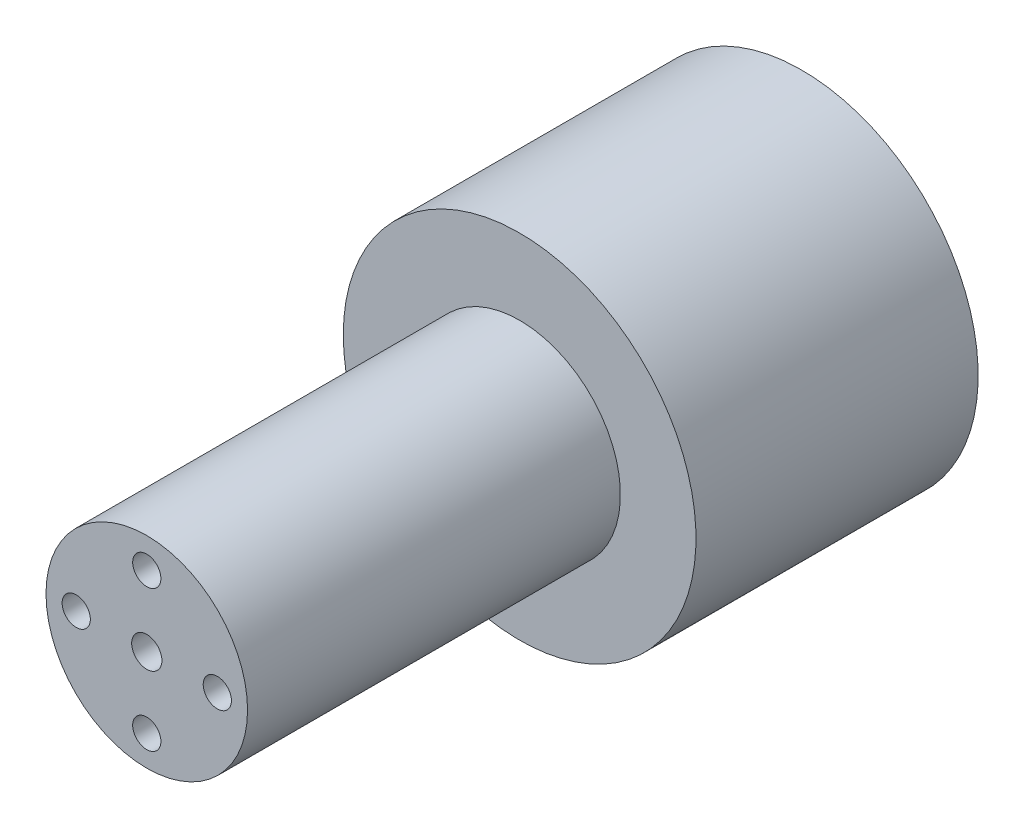
ISO-10303-21;
HEADER;
FILE_DESCRIPTION(('STEP AP214'),'2;1');
FILE_NAME('part.step','',(''),(''),'','','');
FILE_SCHEMA(('AUTOMOTIVE_DESIGN { 1 0 10303 214 1 1 1 1 }'));
ENDSEC;
DATA;
#1=APPLICATION_CONTEXT('core data for automotive mechanical design processes');
#2=APPLICATION_PROTOCOL_DEFINITION('international standard','automotive_design',2000,#1);
#3=PRODUCT_CONTEXT('',#1,'mechanical');
#4=PRODUCT('Part','Part','',(#3));
#5=PRODUCT_RELATED_PRODUCT_CATEGORY('part','',(#4));
#6=PRODUCT_DEFINITION_FORMATION('','',#4);
#7=PRODUCT_DEFINITION_CONTEXT('part definition',#1,'design');
#8=PRODUCT_DEFINITION('design','',#6,#7);
#9=PRODUCT_DEFINITION_SHAPE('','',#8);
#10=(LENGTH_UNIT() NAMED_UNIT(*) SI_UNIT(.MILLI.,.METRE.));
#11=(NAMED_UNIT(*) PLANE_ANGLE_UNIT() SI_UNIT($,.RADIAN.));
#12=(NAMED_UNIT(*) SI_UNIT($,.STERADIAN.) SOLID_ANGLE_UNIT());
#13=UNCERTAINTY_MEASURE_WITH_UNIT(LENGTH_MEASURE(1.E-05),#10,'distance_accuracy_value','');
#14=(GEOMETRIC_REPRESENTATION_CONTEXT(3) GLOBAL_UNCERTAINTY_ASSIGNED_CONTEXT((#13)) GLOBAL_UNIT_ASSIGNED_CONTEXT((#10,
#11,#12)) REPRESENTATION_CONTEXT('',''));
#15=CARTESIAN_POINT('',(0.,0.,0.));
#16=DIRECTION('',(0.,0.,1.));
#17=DIRECTION('',(1.,0.,0.));
#18=AXIS2_PLACEMENT_3D('',#15,#16,#17);
#19=CARTESIAN_POINT('',(0.,0.,65.));
#20=DIRECTION('',(0.,0.,-1.));
#21=DIRECTION('',(-1.,0.,0.));
#22=AXIS2_PLACEMENT_3D('',#19,#20,#21);
#23=CYLINDRICAL_SURFACE('',#22,10.);
#24=CARTESIAN_POINT('',(0.,0.,65.));
#25=DIRECTION('',(0.,0.,1.));
#26=DIRECTION('',(1.,0.,0.));
#27=AXIS2_PLACEMENT_3D('',#24,#25,#26);
#28=CIRCLE('',#27,10.);
#29=CARTESIAN_POINT('',(10.,0.,65.));
#30=VERTEX_POINT('',#29);
#31=EDGE_CURVE('E119',#30,#30,#28,.T.);
#32=ORIENTED_EDGE('',*,*,#31,.F.);
#33=EDGE_LOOP('',(#32));
#34=FACE_BOUND('',#33,.T.);
#35=DIRECTION('',(0.,0.,-1.));
#36=VECTOR('',#35,1.);
#37=CARTESIAN_POINT('',(-9.66941053012023,2.55,65.));
#38=LINE('',#37,#36);
#39=CARTESIAN_POINT('',(-9.66941053012023,2.55,30.6));
#40=VERTEX_POINT('',#39);
#41=CARTESIAN_POINT('',(-9.66941053012023,2.55,37.6));
#42=VERTEX_POINT('',#41);
#43=EDGE_CURVE('E48',#40,#42,#38,.F.);
#44=ORIENTED_EDGE('',*,*,#43,.T.);
#45=CARTESIAN_POINT('',(-9.66941053012023,2.55,37.6));
#46=CARTESIAN_POINT('',(-9.66940247091719,2.5500082217057,37.6704715696643));
#47=CARTESIAN_POINT('',(-9.67018075432079,2.54707880843191,37.7409382259624));
#48=CARTESIAN_POINT('',(-9.67325022280697,2.53540857884758,37.8813436254274));
#49=CARTESIAN_POINT('',(-9.67554114560532,2.52666877002919,37.9512824579902));
#50=CARTESIAN_POINT('',(-9.68157003277275,2.5034651108048,38.0899982076245));
#51=CARTESIAN_POINT('',(-9.68530505524447,2.48901289629602,38.1587771921356));
#52=CARTESIAN_POINT('',(-9.69410383624422,2.45451934485845,38.2948132437216));
#53=CARTESIAN_POINT('',(-9.69916761452135,2.43447792485779,38.36207028816));
#54=CARTESIAN_POINT('',(-9.71613940671657,2.36619215086458,38.5608410225915));
#55=CARTESIAN_POINT('',(-9.72983453938418,2.30976218738288,38.6894970261858));
#56=CARTESIAN_POINT('',(-9.76043395270896,2.17682160087181,38.9354907950415));
#57=CARTESIAN_POINT('',(-9.77733915217684,2.10030522614678,39.0528253052384));
#58=CARTESIAN_POINT('',(-9.81288474482669,1.92748947287877,39.2755732414094));
#59=CARTESIAN_POINT('',(-9.83155360195259,1.83081674855425,39.3806930253747));
#60=CARTESIAN_POINT('',(-9.86827756398352,1.6212336610022,39.5734177844683));
#61=CARTESIAN_POINT('',(-9.88633256996893,1.50832069591604,39.6610199477023));
#62=CARTESIAN_POINT('',(-9.92011108915336,1.26743000946384,39.8174391329621));
#63=CARTESIAN_POINT('',(-9.93579686208664,1.13925702147345,39.8859643247486));
#64=CARTESIAN_POINT('',(-9.96274141902185,0.872750506736556,40.0003802752384));
#65=CARTESIAN_POINT('',(-9.97400109876267,0.734419042562903,40.0462756141792));
#66=CARTESIAN_POINT('',(-9.9906234857324,0.454603386462816,40.1131835316442));
#67=CARTESIAN_POINT('',(-9.99610520280259,0.313246635675868,40.1346989962895));
#68=CARTESIAN_POINT('',(-10.0009692114179,0.0288277357160064,40.1538160254126));
#69=CARTESIAN_POINT('',(-10.0003523053173,-0.114234186645626,40.1514207356646));
#70=CARTESIAN_POINT('',(-9.99317651921549,-0.394504538944483,40.1231428343567));
#71=CARTESIAN_POINT('',(-9.98675513936942,-0.531771856474864,40.0978037077785));
#72=CARTESIAN_POINT('',(-9.96885274870285,-0.800036620932126,40.0252325687347));
#73=CARTESIAN_POINT('',(-9.95737150900061,-0.931033783932646,39.977999565899));
#74=CARTESIAN_POINT('',(-9.93043082294116,-1.18446145517981,39.8625479906677));
#75=CARTESIAN_POINT('',(-9.91493528250005,-1.30680070110949,39.7941378581642));
#76=CARTESIAN_POINT('',(-9.88164407025453,-1.53844901436685,39.6384209493071));
#77=CARTESIAN_POINT('',(-9.86384803552788,-1.64775602050821,39.5511111899102));
#78=CARTESIAN_POINT('',(-9.82730275979038,-1.85347084883836,39.3571802766826));
#79=CARTESIAN_POINT('',(-9.80854078244409,-1.94943121271789,39.2500864116534));
#80=CARTESIAN_POINT('',(-9.7726283391012,-2.1221551920232,39.0210997024044));
#81=CARTESIAN_POINT('',(-9.75547831604193,-2.19891354063648,38.899202811535));
#82=CARTESIAN_POINT('',(-9.72468067624462,-2.33136305128059,38.6431453248529));
#83=CARTESIAN_POINT('',(-9.71105376512276,-2.38693054060623,38.5089182436655));
#84=CARTESIAN_POINT('',(-9.68911390250113,-2.47449871004449,38.2326737317785));
#85=CARTESIAN_POINT('',(-9.68079299964735,-2.50653466449171,38.0906683058226));
#86=CARTESIAN_POINT('',(-9.67357106315976,-2.53418003968817,37.8895195725719));
#87=CARTESIAN_POINT('',(-9.67201335983389,-2.54011341119641,37.8317383624252));
#88=CARTESIAN_POINT('',(-9.66993350396698,-2.54801900884579,37.7159806476918));
#89=CARTESIAN_POINT('',(-9.66940968610688,-2.54999760516071,37.6580046080886));
#90=CARTESIAN_POINT('',(-9.66941053012023,-2.55,37.6));
#91=B_SPLINE_CURVE_WITH_KNOTS('',3,(#45,#46,#47,#48,#49,#50,#51,#52,#53,#54,#55,#56,#57,#58,#59,
#60,#61,#62,#63,#64,#65,#66,#67,#68,#69,#70,#71,#72,#73,#74,#75,#76,#77,#78,#79,#80,#81,#82,#83,
#84,#85,#86,#87,#88,#89,#90),.UNSPECIFIED.,.F.,.F.,(4,2,2,2,2,2,2,2,2,2,2,2,2,2,2,2,2,2,2,2,2,2,
4),(0.,0.211341087985787,0.422645540088371,0.633521775091463,0.844401144496735,1.26573069222128,
1.68718101850248,2.11726981586689,2.54742759492469,2.98384338004687,3.420170799183,
3.8473241654089,4.27442133473423,4.69165889954669,5.10891533995249,5.53006221614701,
5.9512756130533,6.38429592600298,6.81743487974967,7.25306435405402,7.68803946918256,
7.86224127127546,8.03616225009507),.UNSPECIFIED.);
#92=CARTESIAN_POINT('',(-9.66941053012023,-2.55,37.6));
#93=VERTEX_POINT('',#92);
#94=EDGE_CURVE('E128',#42,#93,#91,.T.);
#95=ORIENTED_EDGE('',*,*,#94,.T.);
#96=DIRECTION('',(0.,0.,-1.));
#97=VECTOR('',#96,1.);
#98=CARTESIAN_POINT('',(-9.66941053012023,-2.55,65.));
#99=LINE('',#98,#97);
#100=CARTESIAN_POINT('',(-9.66941053012023,-2.55,30.6));
#101=VERTEX_POINT('',#100);
#102=EDGE_CURVE('E402',#93,#101,#99,.T.);
#103=ORIENTED_EDGE('',*,*,#102,.T.);
#104=CARTESIAN_POINT('',(-9.66941053012023,-2.55,30.6));
#105=CARTESIAN_POINT('',(-9.66940247091719,-2.5500082217057,30.5295284303357));
#106=CARTESIAN_POINT('',(-9.67018075432079,-2.54707880843191,30.4590617740376));
#107=CARTESIAN_POINT('',(-9.67325022280697,-2.53540857884758,30.3186563745726));
#108=CARTESIAN_POINT('',(-9.67554114560532,-2.5266687700292,30.2487175420098));
#109=CARTESIAN_POINT('',(-9.68157003277275,-2.5034651108048,30.1100017923755));
#110=CARTESIAN_POINT('',(-9.68530505524447,-2.48901289629602,30.0412228078644));
#111=CARTESIAN_POINT('',(-9.69410383624422,-2.45451934485845,29.9051867562784));
#112=CARTESIAN_POINT('',(-9.69916761452135,-2.43447792485779,29.83792971184));
#113=CARTESIAN_POINT('',(-9.71613940671657,-2.36619215086458,29.6391589774085));
#114=CARTESIAN_POINT('',(-9.72983453938418,-2.30976218738288,29.5105029738142));
#115=CARTESIAN_POINT('',(-9.76043395270896,-2.17682160087181,29.2645092049585));
#116=CARTESIAN_POINT('',(-9.77733915217684,-2.10030522614678,29.1471746947617));
#117=CARTESIAN_POINT('',(-9.81288474482669,-1.92748947287878,28.9244267585906));
#118=CARTESIAN_POINT('',(-9.83155360195259,-1.83081674855426,28.8193069746253));
#119=CARTESIAN_POINT('',(-9.86827756398352,-1.6212336610022,28.6265822155317));
#120=CARTESIAN_POINT('',(-9.88633256996893,-1.50832069591604,28.5389800522977));
#121=CARTESIAN_POINT('',(-9.92011108915336,-1.26743000946384,28.3825608670379));
#122=CARTESIAN_POINT('',(-9.93579686208664,-1.13925702147346,28.3140356752514));
#123=CARTESIAN_POINT('',(-9.96274141902185,-0.872750506736558,28.1996197247616));
#124=CARTESIAN_POINT('',(-9.97400109876267,-0.734419042562906,28.1537243858208));
#125=CARTESIAN_POINT('',(-9.9906234857324,-0.454603386462819,28.0868164683558));
#126=CARTESIAN_POINT('',(-9.99610520280259,-0.313246635675871,28.0653010037105));
#127=CARTESIAN_POINT('',(-10.0009692114179,-0.02882773571601,28.0461839745874));
#128=CARTESIAN_POINT('',(-10.0003523053173,0.114234186645622,28.0485792643354));
#129=CARTESIAN_POINT('',(-9.99317651921549,0.394504538944479,28.0768571656433));
#130=CARTESIAN_POINT('',(-9.98675513936942,0.531771856474861,28.1021962922215));
#131=CARTESIAN_POINT('',(-9.96885274870285,0.800036620932123,28.1747674312653));
#132=CARTESIAN_POINT('',(-9.95737150900061,0.931033783932643,28.222000434101));
#133=CARTESIAN_POINT('',(-9.93043082294116,1.1844614551798,28.3374520093323));
#134=CARTESIAN_POINT('',(-9.91493528250005,1.30680070110948,28.4058621418358));
#135=CARTESIAN_POINT('',(-9.88164407025453,1.53844901436684,28.5615790506929));
#136=CARTESIAN_POINT('',(-9.86384803552789,1.6477560205082,28.6488888100898));
#137=CARTESIAN_POINT('',(-9.82730275979039,1.85347084883836,28.8428197233174));
#138=CARTESIAN_POINT('',(-9.8085407824441,1.94943121271789,28.9499135883466));
#139=CARTESIAN_POINT('',(-9.7726283391012,2.1221551920232,29.1789002975956));
#140=CARTESIAN_POINT('',(-9.75547831604193,2.19891354063647,29.300797188465));
#141=CARTESIAN_POINT('',(-9.72468067624462,2.33136305128059,29.5568546751471));
#142=CARTESIAN_POINT('',(-9.71105376512276,2.38693054060623,29.6910817563345));
#143=CARTESIAN_POINT('',(-9.68911390250113,2.47449871004449,29.9673262682215));
#144=CARTESIAN_POINT('',(-9.68079299964735,2.50653466449171,30.1093316941774));
#145=CARTESIAN_POINT('',(-9.67357106315976,2.53418003968817,30.3104804274281));
#146=CARTESIAN_POINT('',(-9.67201335983389,2.5401134111964,30.3682616375748));
#147=CARTESIAN_POINT('',(-9.66993350396698,2.54801900884579,30.4840193523082));
#148=CARTESIAN_POINT('',(-9.66940968610688,2.54999760516071,30.5419953919114));
#149=CARTESIAN_POINT('',(-9.66941053012023,2.55,30.6));
#150=B_SPLINE_CURVE_WITH_KNOTS('',3,(#104,#105,#106,#107,#108,#109,#110,#111,#112,#113,#114,
#115,#116,#117,#118,#119,#120,#121,#122,#123,#124,#125,#126,#127,#128,#129,#130,#131,#132,#133,
#134,#135,#136,#137,#138,#139,#140,#141,#142,#143,#144,#145,#146,#147,#148,#149),.UNSPECIFIED.,
.F.,.F.,(4,2,2,2,2,2,2,2,2,2,2,2,2,2,2,2,2,2,2,2,2,2,4),(0.,0.21134108798578,0.42264554008836,
0.633521775091466,0.844401144496732,1.26573069222128,1.68718101850247,2.11726981586689,
2.54742759492469,2.98384338004687,3.42017079918299,3.8473241654089,4.27442133473422,
4.69165889954669,5.10891533995249,5.530062216147,5.9512756130533,6.38429592600297,
6.81743487974967,7.25306435405402,7.68803946918255,7.86224127127545,8.03616225009507),.UNSPECIFIED.);
#151=EDGE_CURVE('E55',#101,#40,#150,.T.);
#152=ORIENTED_EDGE('',*,*,#151,.T.);
#153=EDGE_LOOP('',(#44,#95,#103,#152));
#154=FACE_BOUND('',#153,.T.);
#155=CARTESIAN_POINT('',(0.,0.,28.));
#156=DIRECTION('',(0.,0.,-1.));
#157=DIRECTION('',(-1.,0.,0.));
#158=AXIS2_PLACEMENT_3D('',#155,#156,#157);
#159=CIRCLE('',#158,10.);
#160=CARTESIAN_POINT('',(-10.,0.,28.));
#161=VERTEX_POINT('',#160);
#162=EDGE_CURVE('E11',#161,#161,#159,.T.);
#163=ORIENTED_EDGE('',*,*,#162,.F.);
#164=EDGE_LOOP('',(#163));
#165=FACE_BOUND('',#164,.T.);
#166=ADVANCED_FACE('F39',(#34,#154,#165),#23,.T.);
#167=CARTESIAN_POINT('',(0.,0.,65.));
#168=DIRECTION('',(0.,0.,1.));
#169=DIRECTION('',(1.,0.,0.));
#170=AXIS2_PLACEMENT_3D('',#167,#168,#169);
#171=PLANE('',#170);
#172=CARTESIAN_POINT('',(0.,0.,65.));
#173=DIRECTION('',(0.,0.,1.));
#174=DIRECTION('',(1.,0.,0.));
#175=AXIS2_PLACEMENT_3D('',#172,#173,#174);
#176=CIRCLE('',#175,1.5);
#177=CARTESIAN_POINT('',(1.5,0.,65.));
#178=VERTEX_POINT('',#177);
#179=EDGE_CURVE('E202',#178,#178,#176,.T.);
#180=ORIENTED_EDGE('',*,*,#179,.F.);
#181=EDGE_LOOP('',(#180));
#182=FACE_BOUND('',#181,.T.);
#183=CARTESIAN_POINT('',(0.,7.,65.));
#184=DIRECTION('',(0.,0.,1.));
#185=DIRECTION('',(1.,0.,0.));
#186=AXIS2_PLACEMENT_3D('',#183,#184,#185);
#187=CIRCLE('',#186,1.4);
#188=CARTESIAN_POINT('',(1.4,7.,65.));
#189=VERTEX_POINT('',#188);
#190=EDGE_CURVE('E193',#189,#189,#187,.T.);
#191=ORIENTED_EDGE('',*,*,#190,.F.);
#192=EDGE_LOOP('',(#191));
#193=FACE_BOUND('',#192,.T.);
#194=CARTESIAN_POINT('',(7.,0.,65.));
#195=DIRECTION('',(0.,0.,1.));
#196=DIRECTION('',(1.,0.,0.));
#197=AXIS2_PLACEMENT_3D('',#194,#195,#196);
#198=CIRCLE('',#197,1.4);
#199=CARTESIAN_POINT('',(8.4,0.,65.));
#200=VERTEX_POINT('',#199);
#201=EDGE_CURVE('E208',#200,#200,#198,.T.);
#202=ORIENTED_EDGE('',*,*,#201,.F.);
#203=EDGE_LOOP('',(#202));
#204=FACE_BOUND('',#203,.T.);
#205=CARTESIAN_POINT('',(0.,-7.,65.));
#206=DIRECTION('',(0.,0.,1.));
#207=DIRECTION('',(1.,0.,0.));
#208=AXIS2_PLACEMENT_3D('',#205,#206,#207);
#209=CIRCLE('',#208,1.4);
#210=CARTESIAN_POINT('',(1.39999999999995,-7.,65.));
#211=VERTEX_POINT('',#210);
#212=EDGE_CURVE('E216',#211,#211,#209,.T.);
#213=ORIENTED_EDGE('',*,*,#212,.F.);
#214=EDGE_LOOP('',(#213));
#215=FACE_BOUND('',#214,.T.);
#216=CARTESIAN_POINT('',(-7.,0.,65.));
#217=DIRECTION('',(0.,0.,1.));
#218=DIRECTION('',(1.,0.,0.));
#219=AXIS2_PLACEMENT_3D('',#216,#217,#218);
#220=CIRCLE('',#219,1.4);
#221=CARTESIAN_POINT('',(-5.6,0.,65.));
#222=VERTEX_POINT('',#221);
#223=EDGE_CURVE('E224',#222,#222,#220,.T.);
#224=ORIENTED_EDGE('',*,*,#223,.F.);
#225=EDGE_LOOP('',(#224));
#226=FACE_BOUND('',#225,.T.);
#227=ORIENTED_EDGE('',*,*,#31,.T.);
#228=EDGE_LOOP('',(#227));
#229=FACE_BOUND('',#228,.T.);
#230=ADVANCED_FACE('F155',(#182,#193,#204,#215,#226,#229),#171,.T.);
#231=CARTESIAN_POINT('',(-7.5,0.,30.6));
#232=DIRECTION('',(-1.,0.,0.));
#233=DIRECTION('',(0.,0.,1.));
#234=AXIS2_PLACEMENT_3D('',#231,#232,#233);
#235=CYLINDRICAL_SURFACE('',#234,2.55);
#236=DIRECTION('',(-1.,0.,0.));
#237=VECTOR('',#236,1.);
#238=CARTESIAN_POINT('',(-7.5,-2.55,30.6));
#239=LINE('',#238,#237);
#240=CARTESIAN_POINT('',(-7.5,-2.55,30.6));
#241=VERTEX_POINT('',#240);
#242=EDGE_CURVE('E79',#241,#101,#239,.T.);
#243=ORIENTED_EDGE('',*,*,#242,.F.);
#244=CARTESIAN_POINT('',(-7.5,0.,30.6));
#245=DIRECTION('',(-1.,0.,0.));
#246=DIRECTION('',(0.,0.,1.));
#247=AXIS2_PLACEMENT_3D('',#244,#245,#246);
#248=CIRCLE('',#247,2.55);
#249=CARTESIAN_POINT('',(-7.5,2.55,30.6));
#250=VERTEX_POINT('',#249);
#251=EDGE_CURVE('E83',#250,#241,#248,.T.);
#252=ORIENTED_EDGE('',*,*,#251,.F.);
#253=DIRECTION('',(-1.,0.,0.));
#254=VECTOR('',#253,1.);
#255=CARTESIAN_POINT('',(-7.5,2.55,30.6));
#256=LINE('',#255,#254);
#257=EDGE_CURVE('E116',#250,#40,#256,.T.);
#258=ORIENTED_EDGE('',*,*,#257,.T.);
#259=ORIENTED_EDGE('',*,*,#151,.F.);
#260=EDGE_LOOP('',(#243,#252,#258,#259));
#261=FACE_BOUND('',#260,.T.);
#262=ADVANCED_FACE('F81',(#261),#235,.F.);
#263=CARTESIAN_POINT('',(-7.5,2.55,30.6));
#264=DIRECTION('',(0.,1.,0.));
#265=DIRECTION('',(0.,0.,1.));
#266=AXIS2_PLACEMENT_3D('',#263,#264,#265);
#267=PLANE('',#266);
#268=ORIENTED_EDGE('',*,*,#257,.F.);
#269=DIRECTION('',(0.,0.,-1.));
#270=VECTOR('',#269,1.);
#271=CARTESIAN_POINT('',(-7.5,2.55,30.6));
#272=LINE('',#271,#270);
#273=CARTESIAN_POINT('',(-7.5,2.55,37.6));
#274=VERTEX_POINT('',#273);
#275=EDGE_CURVE('E89',#274,#250,#272,.T.);
#276=ORIENTED_EDGE('',*,*,#275,.F.);
#277=DIRECTION('',(-1.,0.,0.));
#278=VECTOR('',#277,1.);
#279=CARTESIAN_POINT('',(-7.5,2.55,37.6));
#280=LINE('',#279,#278);
#281=EDGE_CURVE('E120',#274,#42,#280,.T.);
#282=ORIENTED_EDGE('',*,*,#281,.T.);
#283=ORIENTED_EDGE('',*,*,#43,.F.);
#284=EDGE_LOOP('',(#268,#276,#282,#283));
#285=FACE_BOUND('',#284,.T.);
#286=ADVANCED_FACE('F148',(#285),#267,.F.);
#287=CARTESIAN_POINT('',(-7.5,0.,37.6));
#288=DIRECTION('',(-1.,0.,0.));
#289=DIRECTION('',(0.,0.,1.));
#290=AXIS2_PLACEMENT_3D('',#287,#288,#289);
#291=CYLINDRICAL_SURFACE('',#290,2.55);
#292=ORIENTED_EDGE('',*,*,#281,.F.);
#293=CARTESIAN_POINT('',(-7.5,0.,37.6));
#294=DIRECTION('',(-1.,0.,0.));
#295=DIRECTION('',(0.,0.,1.));
#296=AXIS2_PLACEMENT_3D('',#293,#294,#295);
#297=CIRCLE('',#296,2.55);
#298=CARTESIAN_POINT('',(-7.5,-2.55,37.6));
#299=VERTEX_POINT('',#298);
#300=EDGE_CURVE('E99',#299,#274,#297,.T.);
#301=ORIENTED_EDGE('',*,*,#300,.F.);
#302=DIRECTION('',(-1.,0.,0.));
#303=VECTOR('',#302,1.);
#304=CARTESIAN_POINT('',(-7.5,-2.55,37.6));
#305=LINE('',#304,#303);
#306=EDGE_CURVE('E88',#299,#93,#305,.T.);
#307=ORIENTED_EDGE('',*,*,#306,.T.);
#308=ORIENTED_EDGE('',*,*,#94,.F.);
#309=EDGE_LOOP('',(#292,#301,#307,#308));
#310=FACE_BOUND('',#309,.T.);
#311=ADVANCED_FACE('F143',(#310),#291,.F.);
#312=CARTESIAN_POINT('',(-7.5,-2.55,30.6));
#313=DIRECTION('',(0.,-1.,0.));
#314=DIRECTION('',(0.,0.,-1.));
#315=AXIS2_PLACEMENT_3D('',#312,#313,#314);
#316=PLANE('',#315);
#317=ORIENTED_EDGE('',*,*,#306,.F.);
#318=DIRECTION('',(0.,0.,1.));
#319=VECTOR('',#318,1.);
#320=CARTESIAN_POINT('',(-7.5,-2.55,30.6));
#321=LINE('',#320,#319);
#322=EDGE_CURVE('E92',#241,#299,#321,.T.);
#323=ORIENTED_EDGE('',*,*,#322,.F.);
#324=ORIENTED_EDGE('',*,*,#242,.T.);
#325=ORIENTED_EDGE('',*,*,#102,.F.);
#326=EDGE_LOOP('',(#317,#323,#324,#325));
#327=FACE_BOUND('',#326,.T.);
#328=ADVANCED_FACE('F93',(#327),#316,.F.);
#329=CARTESIAN_POINT('',(-7.5,0.,30.6));
#330=DIRECTION('',(-1.,0.,0.));
#331=DIRECTION('',(0.,0.,1.));
#332=AXIS2_PLACEMENT_3D('',#329,#330,#331);
#333=PLANE('',#332);
#334=ORIENTED_EDGE('',*,*,#251,.T.);
#335=ORIENTED_EDGE('',*,*,#322,.T.);
#336=ORIENTED_EDGE('',*,*,#300,.T.);
#337=ORIENTED_EDGE('',*,*,#275,.T.);
#338=EDGE_LOOP('',(#334,#335,#336,#337));
#339=FACE_BOUND('',#338,.T.);
#340=ADVANCED_FACE('F101',(#339),#333,.T.);
#341=CARTESIAN_POINT('',(0.,0.,28.));
#342=DIRECTION('',(0.,0.,-1.));
#343=DIRECTION('',(-1.,0.,0.));
#344=AXIS2_PLACEMENT_3D('',#341,#342,#343);
#345=CYLINDRICAL_SURFACE('',#344,17.5);
#346=CARTESIAN_POINT('',(0.,0.,28.));
#347=DIRECTION('',(0.,0.,-1.));
#348=DIRECTION('',(-1.,0.,0.));
#349=AXIS2_PLACEMENT_3D('',#346,#347,#348);
#350=CIRCLE('',#349,17.5);
#351=CARTESIAN_POINT('',(-17.5,0.,28.));
#352=VERTEX_POINT('',#351);
#353=EDGE_CURVE('E104',#352,#352,#350,.T.);
#354=ORIENTED_EDGE('',*,*,#353,.T.);
#355=EDGE_LOOP('',(#354));
#356=FACE_BOUND('',#355,.T.);
#357=CARTESIAN_POINT('',(0.,0.,0.));
#358=DIRECTION('',(0.,0.,-1.));
#359=DIRECTION('',(-1.,0.,0.));
#360=AXIS2_PLACEMENT_3D('',#357,#358,#359);
#361=CIRCLE('',#360,17.5);
#362=CARTESIAN_POINT('',(-17.5,0.,0.));
#363=VERTEX_POINT('',#362);
#364=EDGE_CURVE('E108',#363,#363,#361,.T.);
#365=ORIENTED_EDGE('',*,*,#364,.F.);
#366=EDGE_LOOP('',(#365));
#367=FACE_BOUND('',#366,.T.);
#368=ADVANCED_FACE('F170',(#356,#367),#345,.T.);
#369=CARTESIAN_POINT('',(0.,0.,28.));
#370=DIRECTION('',(0.,0.,-1.));
#371=DIRECTION('',(-1.,0.,0.));
#372=AXIS2_PLACEMENT_3D('',#369,#370,#371);
#373=PLANE('',#372);
#374=ORIENTED_EDGE('',*,*,#162,.T.);
#375=EDGE_LOOP('',(#374));
#376=FACE_BOUND('',#375,.T.);
#377=ORIENTED_EDGE('',*,*,#353,.F.);
#378=EDGE_LOOP('',(#377));
#379=FACE_BOUND('',#378,.T.);
#380=ADVANCED_FACE('F161',(#376,#379),#373,.F.);
#381=CARTESIAN_POINT('',(0.,0.,0.));
#382=DIRECTION('',(0.,0.,1.));
#383=DIRECTION('',(1.,0.,0.));
#384=AXIS2_PLACEMENT_3D('',#381,#382,#383);
#385=PLANE('',#384);
#386=ORIENTED_EDGE('',*,*,#364,.T.);
#387=EDGE_LOOP('',(#386));
#388=FACE_BOUND('',#387,.T.);
#389=ADVANCED_FACE('F158',(#388),#385,.F.);
#390=CARTESIAN_POINT('',(-7.,0.,62.));
#391=DIRECTION('',(0.,0.,1.));
#392=DIRECTION('',(1.,0.,0.));
#393=AXIS2_PLACEMENT_3D('',#390,#391,#392);
#394=CYLINDRICAL_SURFACE('',#393,1.4);
#395=CARTESIAN_POINT('',(-7.,0.,62.));
#396=DIRECTION('',(0.,0.,1.));
#397=DIRECTION('',(1.,0.,0.));
#398=AXIS2_PLACEMENT_3D('',#395,#396,#397);
#399=CIRCLE('',#398,1.4);
#400=CARTESIAN_POINT('',(-5.6,0.,62.));
#401=VERTEX_POINT('',#400);
#402=EDGE_CURVE('E220',#401,#401,#399,.T.);
#403=ORIENTED_EDGE('',*,*,#402,.F.);
#404=EDGE_LOOP('',(#403));
#405=FACE_BOUND('',#404,.T.);
#406=ORIENTED_EDGE('',*,*,#223,.T.);
#407=EDGE_LOOP('',(#406));
#408=FACE_BOUND('',#407,.T.);
#409=ADVANCED_FACE('F160',(#405,#408),#394,.F.);
#410=CARTESIAN_POINT('',(-7.,0.,62.));
#411=DIRECTION('',(0.,0.,1.));
#412=DIRECTION('',(1.,0.,0.));
#413=AXIS2_PLACEMENT_3D('',#410,#411,#412);
#414=PLANE('',#413);
#415=ORIENTED_EDGE('',*,*,#402,.T.);
#416=EDGE_LOOP('',(#415));
#417=FACE_BOUND('',#416,.T.);
#418=ADVANCED_FACE('F167',(#417),#414,.T.);
#419=CARTESIAN_POINT('',(0.,-7.,62.));
#420=DIRECTION('',(0.,0.,1.));
#421=DIRECTION('',(1.,0.,0.));
#422=AXIS2_PLACEMENT_3D('',#419,#420,#421);
#423=CYLINDRICAL_SURFACE('',#422,1.4);
#424=CARTESIAN_POINT('',(0.,-7.,62.));
#425=DIRECTION('',(0.,0.,1.));
#426=DIRECTION('',(1.,0.,0.));
#427=AXIS2_PLACEMENT_3D('',#424,#425,#426);
#428=CIRCLE('',#427,1.4);
#429=CARTESIAN_POINT('',(1.39999999999995,-7.,62.));
#430=VERTEX_POINT('',#429);
#431=EDGE_CURVE('E212',#430,#430,#428,.T.);
#432=ORIENTED_EDGE('',*,*,#431,.F.);
#433=EDGE_LOOP('',(#432));
#434=FACE_BOUND('',#433,.T.);
#435=ORIENTED_EDGE('',*,*,#212,.T.);
#436=EDGE_LOOP('',(#435));
#437=FACE_BOUND('',#436,.T.);
#438=ADVANCED_FACE('F248',(#434,#437),#423,.F.);
#439=CARTESIAN_POINT('',(0.,-7.,62.));
#440=DIRECTION('',(0.,0.,1.));
#441=DIRECTION('',(1.,0.,0.));
#442=AXIS2_PLACEMENT_3D('',#439,#440,#441);
#443=PLANE('',#442);
#444=ORIENTED_EDGE('',*,*,#431,.T.);
#445=EDGE_LOOP('',(#444));
#446=FACE_BOUND('',#445,.T.);
#447=ADVANCED_FACE('F250',(#446),#443,.T.);
#448=CARTESIAN_POINT('',(7.,0.,62.));
#449=DIRECTION('',(0.,0.,1.));
#450=DIRECTION('',(1.,0.,0.));
#451=AXIS2_PLACEMENT_3D('',#448,#449,#450);
#452=CYLINDRICAL_SURFACE('',#451,1.4);
#453=CARTESIAN_POINT('',(7.,0.,62.));
#454=DIRECTION('',(0.,0.,1.));
#455=DIRECTION('',(1.,0.,0.));
#456=AXIS2_PLACEMENT_3D('',#453,#454,#455);
#457=CIRCLE('',#456,1.4);
#458=CARTESIAN_POINT('',(8.4,0.,62.));
#459=VERTEX_POINT('',#458);
#460=EDGE_CURVE('E199',#459,#459,#457,.T.);
#461=ORIENTED_EDGE('',*,*,#460,.F.);
#462=EDGE_LOOP('',(#461));
#463=FACE_BOUND('',#462,.T.);
#464=ORIENTED_EDGE('',*,*,#201,.T.);
#465=EDGE_LOOP('',(#464));
#466=FACE_BOUND('',#465,.T.);
#467=ADVANCED_FACE('F257',(#463,#466),#452,.F.);
#468=CARTESIAN_POINT('',(7.,0.,62.));
#469=DIRECTION('',(0.,0.,1.));
#470=DIRECTION('',(1.,0.,0.));
#471=AXIS2_PLACEMENT_3D('',#468,#469,#470);
#472=PLANE('',#471);
#473=ORIENTED_EDGE('',*,*,#460,.T.);
#474=EDGE_LOOP('',(#473));
#475=FACE_BOUND('',#474,.T.);
#476=ADVANCED_FACE('F313',(#475),#472,.T.);
#477=CARTESIAN_POINT('',(0.,7.,62.));
#478=DIRECTION('',(0.,0.,1.));
#479=DIRECTION('',(1.,0.,0.));
#480=AXIS2_PLACEMENT_3D('',#477,#478,#479);
#481=CYLINDRICAL_SURFACE('',#480,1.4);
#482=CARTESIAN_POINT('',(0.,7.,62.));
#483=DIRECTION('',(0.,0.,1.));
#484=DIRECTION('',(1.,0.,0.));
#485=AXIS2_PLACEMENT_3D('',#482,#483,#484);
#486=CIRCLE('',#485,1.4);
#487=CARTESIAN_POINT('',(1.4,7.,62.));
#488=VERTEX_POINT('',#487);
#489=EDGE_CURVE('E190',#488,#488,#486,.T.);
#490=ORIENTED_EDGE('',*,*,#489,.F.);
#491=EDGE_LOOP('',(#490));
#492=FACE_BOUND('',#491,.T.);
#493=ORIENTED_EDGE('',*,*,#190,.T.);
#494=EDGE_LOOP('',(#493));
#495=FACE_BOUND('',#494,.T.);
#496=ADVANCED_FACE('F322',(#492,#495),#481,.F.);
#497=CARTESIAN_POINT('',(0.,7.,62.));
#498=DIRECTION('',(0.,0.,1.));
#499=DIRECTION('',(1.,0.,0.));
#500=AXIS2_PLACEMENT_3D('',#497,#498,#499);
#501=PLANE('',#500);
#502=ORIENTED_EDGE('',*,*,#489,.T.);
#503=EDGE_LOOP('',(#502));
#504=FACE_BOUND('',#503,.T.);
#505=ADVANCED_FACE('F332',(#504),#501,.T.);
#506=CARTESIAN_POINT('',(0.,0.,62.));
#507=DIRECTION('',(0.,0.,1.));
#508=DIRECTION('',(1.,0.,0.));
#509=AXIS2_PLACEMENT_3D('',#506,#507,#508);
#510=CYLINDRICAL_SURFACE('',#509,1.5);
#511=CARTESIAN_POINT('',(0.,0.,62.));
#512=DIRECTION('',(0.,0.,1.));
#513=DIRECTION('',(1.,0.,0.));
#514=AXIS2_PLACEMENT_3D('',#511,#512,#513);
#515=CIRCLE('',#514,1.5);
#516=CARTESIAN_POINT('',(1.5,0.,62.));
#517=VERTEX_POINT('',#516);
#518=EDGE_CURVE('E227',#517,#517,#515,.T.);
#519=ORIENTED_EDGE('',*,*,#518,.F.);
#520=EDGE_LOOP('',(#519));
#521=FACE_BOUND('',#520,.T.);
#522=ORIENTED_EDGE('',*,*,#179,.T.);
#523=EDGE_LOOP('',(#522));
#524=FACE_BOUND('',#523,.T.);
#525=ADVANCED_FACE('F238',(#521,#524),#510,.F.);
#526=CARTESIAN_POINT('',(0.,0.,62.));
#527=DIRECTION('',(0.,0.,1.));
#528=DIRECTION('',(1.,0.,0.));
#529=AXIS2_PLACEMENT_3D('',#526,#527,#528);
#530=PLANE('',#529);
#531=ORIENTED_EDGE('',*,*,#518,.T.);
#532=EDGE_LOOP('',(#531));
#533=FACE_BOUND('',#532,.T.);
#534=ADVANCED_FACE('F356',(#533),#530,.T.);
#535=CLOSED_SHELL('',(#166,#230,#262,#286,#311,#328,#340,#368,#380,#389,#409,#418,#438,#447,
#467,#476,#496,#505,#525,#534));
#536=MANIFOLD_SOLID_BREP('B2',#535);
#537=ADVANCED_BREP_SHAPE_REPRESENTATION('',(#18,#536),#14);
#538=SHAPE_DEFINITION_REPRESENTATION(#9,#537);
ENDSEC;
END-ISO-10303-21;
